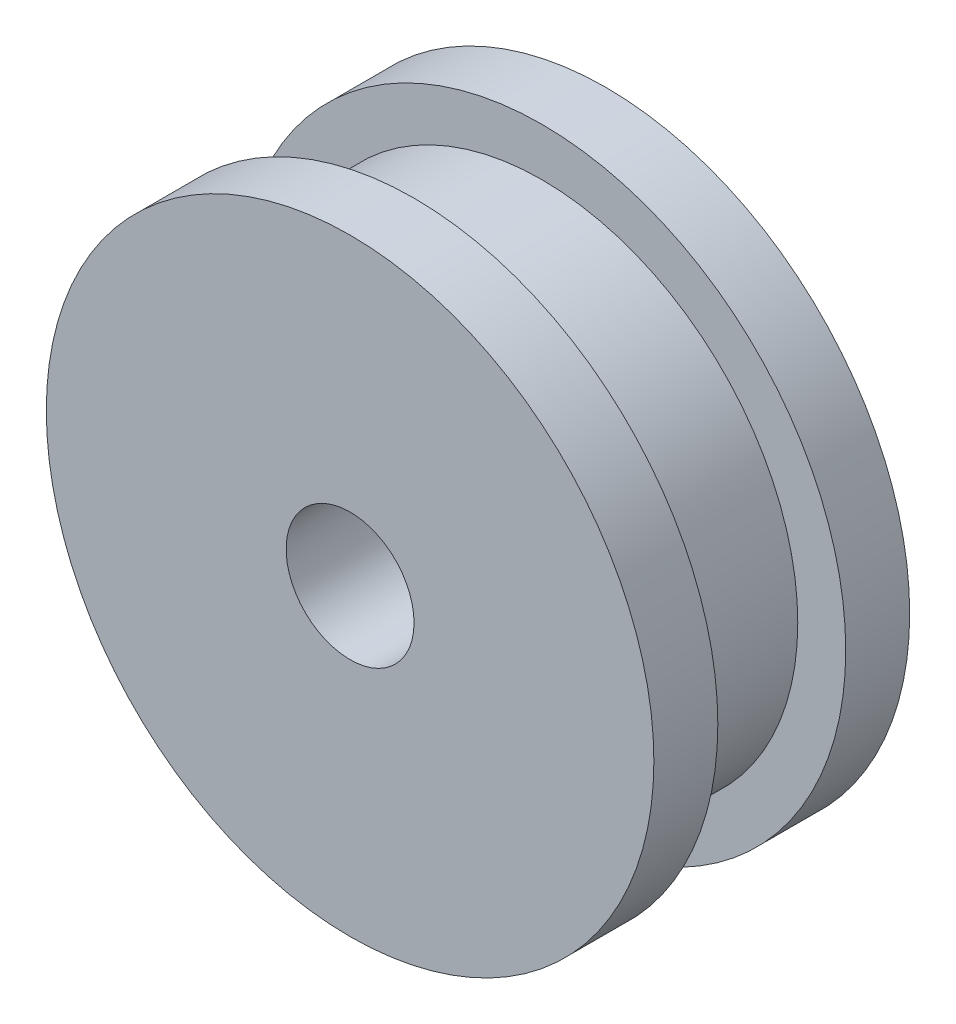
ISO-10303-21;
HEADER;
FILE_DESCRIPTION(('STEP AP214'),'2;1');
FILE_NAME('part.step','',(''),(''),'','','');
FILE_SCHEMA(('AUTOMOTIVE_DESIGN { 1 0 10303 214 1 1 1 1 }'));
ENDSEC;
DATA;
#1=APPLICATION_CONTEXT('core data for automotive mechanical design processes');
#2=APPLICATION_PROTOCOL_DEFINITION('international standard','automotive_design',2000,#1);
#3=PRODUCT_CONTEXT('',#1,'mechanical');
#4=PRODUCT('Part','Part','',(#3));
#5=PRODUCT_RELATED_PRODUCT_CATEGORY('part','',(#4));
#6=PRODUCT_DEFINITION_FORMATION('','',#4);
#7=PRODUCT_DEFINITION_CONTEXT('part definition',#1,'design');
#8=PRODUCT_DEFINITION('design','',#6,#7);
#9=PRODUCT_DEFINITION_SHAPE('','',#8);
#10=(LENGTH_UNIT() NAMED_UNIT(*) SI_UNIT(.MILLI.,.METRE.));
#11=(NAMED_UNIT(*) PLANE_ANGLE_UNIT() SI_UNIT($,.RADIAN.));
#12=(NAMED_UNIT(*) SI_UNIT($,.STERADIAN.) SOLID_ANGLE_UNIT());
#13=UNCERTAINTY_MEASURE_WITH_UNIT(LENGTH_MEASURE(1.E-05),#10,'distance_accuracy_value','');
#14=(GEOMETRIC_REPRESENTATION_CONTEXT(3) GLOBAL_UNCERTAINTY_ASSIGNED_CONTEXT((#13)) GLOBAL_UNIT_ASSIGNED_CONTEXT((#10,
#11,#12)) REPRESENTATION_CONTEXT('',''));
#15=CARTESIAN_POINT('',(0.,0.,0.));
#16=DIRECTION('',(0.,0.,1.));
#17=DIRECTION('',(1.,0.,0.));
#18=AXIS2_PLACEMENT_3D('',#15,#16,#17);
#19=CARTESIAN_POINT('',(0.,0.,1.));
#20=DIRECTION('',(0.,0.,-1.));
#21=DIRECTION('',(-1.,0.,0.));
#22=AXIS2_PLACEMENT_3D('',#19,#20,#21);
#23=CYLINDRICAL_SURFACE('',#22,4.);
#24=CARTESIAN_POINT('',(0.,0.,1.));
#25=DIRECTION('',(0.,0.,1.));
#26=DIRECTION('',(1.,0.,0.));
#27=AXIS2_PLACEMENT_3D('',#24,#25,#26);
#28=CIRCLE('',#27,4.);
#29=CARTESIAN_POINT('',(4.,0.,1.));
#30=VERTEX_POINT('',#29);
#31=EDGE_CURVE('E10',#30,#30,#28,.T.);
#32=ORIENTED_EDGE('',*,*,#31,.F.);
#33=EDGE_LOOP('',(#32));
#34=FACE_BOUND('',#33,.T.);
#35=CARTESIAN_POINT('',(0.,0.,-1.));
#36=DIRECTION('',(0.,0.,1.));
#37=DIRECTION('',(1.,0.,0.));
#38=AXIS2_PLACEMENT_3D('',#35,#36,#37);
#39=CIRCLE('',#38,4.);
#40=CARTESIAN_POINT('',(4.,0.,-1.));
#41=VERTEX_POINT('',#40);
#42=EDGE_CURVE('E48',#41,#41,#39,.T.);
#43=ORIENTED_EDGE('',*,*,#42,.T.);
#44=EDGE_LOOP('',(#43));
#45=FACE_BOUND('',#44,.T.);
#46=ADVANCED_FACE('F45',(#34,#45),#23,.T.);
#47=CARTESIAN_POINT('',(0.,0.,2.));
#48=DIRECTION('',(0.,0.,-1.));
#49=DIRECTION('',(-1.,0.,0.));
#50=AXIS2_PLACEMENT_3D('',#47,#48,#49);
#51=CYLINDRICAL_SURFACE('',#50,4.75);
#52=CARTESIAN_POINT('',(0.,0.,2.));
#53=DIRECTION('',(0.,0.,1.));
#54=DIRECTION('',(1.,0.,0.));
#55=AXIS2_PLACEMENT_3D('',#52,#53,#54);
#56=CIRCLE('',#55,4.75);
#57=CARTESIAN_POINT('',(4.75,0.,2.));
#58=VERTEX_POINT('',#57);
#59=EDGE_CURVE('E52',#58,#58,#56,.T.);
#60=ORIENTED_EDGE('',*,*,#59,.F.);
#61=EDGE_LOOP('',(#60));
#62=FACE_BOUND('',#61,.T.);
#63=CARTESIAN_POINT('',(0.,0.,1.));
#64=DIRECTION('',(0.,0.,1.));
#65=DIRECTION('',(1.,0.,0.));
#66=AXIS2_PLACEMENT_3D('',#63,#64,#65);
#67=CIRCLE('',#66,4.75);
#68=CARTESIAN_POINT('',(4.75,0.,1.));
#69=VERTEX_POINT('',#68);
#70=EDGE_CURVE('E56',#69,#69,#67,.T.);
#71=ORIENTED_EDGE('',*,*,#70,.T.);
#72=EDGE_LOOP('',(#71));
#73=FACE_BOUND('',#72,.T.);
#74=ADVANCED_FACE('F88',(#62,#73),#51,.T.);
#75=CARTESIAN_POINT('',(0.,0.,2.));
#76=DIRECTION('',(0.,0.,1.));
#77=DIRECTION('',(1.,0.,0.));
#78=AXIS2_PLACEMENT_3D('',#75,#76,#77);
#79=PLANE('',#78);
#80=CARTESIAN_POINT('',(0.,0.,2.));
#81=DIRECTION('',(0.,0.,1.));
#82=DIRECTION('',(1.,0.,0.));
#83=AXIS2_PLACEMENT_3D('',#80,#81,#82);
#84=CIRCLE('',#83,1.);
#85=CARTESIAN_POINT('',(1.,0.,2.));
#86=VERTEX_POINT('',#85);
#87=EDGE_CURVE('E68',#86,#86,#84,.T.);
#88=ORIENTED_EDGE('',*,*,#87,.F.);
#89=EDGE_LOOP('',(#88));
#90=FACE_BOUND('',#89,.T.);
#91=ORIENTED_EDGE('',*,*,#59,.T.);
#92=EDGE_LOOP('',(#91));
#93=FACE_BOUND('',#92,.T.);
#94=ADVANCED_FACE('F84',(#90,#93),#79,.T.);
#95=CARTESIAN_POINT('',(0.,0.,1.));
#96=DIRECTION('',(0.,0.,1.));
#97=DIRECTION('',(1.,0.,0.));
#98=AXIS2_PLACEMENT_3D('',#95,#96,#97);
#99=PLANE('',#98);
#100=ORIENTED_EDGE('',*,*,#31,.T.);
#101=EDGE_LOOP('',(#100));
#102=FACE_BOUND('',#101,.T.);
#103=ORIENTED_EDGE('',*,*,#70,.F.);
#104=EDGE_LOOP('',(#103));
#105=FACE_BOUND('',#104,.T.);
#106=ADVANCED_FACE('F87',(#102,#105),#99,.F.);
#107=CARTESIAN_POINT('',(0.,0.,-2.));
#108=DIRECTION('',(0.,0.,1.));
#109=DIRECTION('',(1.,0.,0.));
#110=AXIS2_PLACEMENT_3D('',#107,#108,#109);
#111=CYLINDRICAL_SURFACE('',#110,4.75);
#112=CARTESIAN_POINT('',(0.,0.,-2.));
#113=DIRECTION('',(0.,0.,1.));
#114=DIRECTION('',(1.,0.,0.));
#115=AXIS2_PLACEMENT_3D('',#112,#113,#114);
#116=CIRCLE('',#115,4.75);
#117=CARTESIAN_POINT('',(4.75,0.,-2.));
#118=VERTEX_POINT('',#117);
#119=EDGE_CURVE('E64',#118,#118,#116,.T.);
#120=ORIENTED_EDGE('',*,*,#119,.T.);
#121=EDGE_LOOP('',(#120));
#122=FACE_BOUND('',#121,.T.);
#123=CARTESIAN_POINT('',(0.,0.,-1.));
#124=DIRECTION('',(0.,0.,1.));
#125=DIRECTION('',(1.,0.,0.));
#126=AXIS2_PLACEMENT_3D('',#123,#124,#125);
#127=CIRCLE('',#126,4.75);
#128=CARTESIAN_POINT('',(4.75,0.,-1.));
#129=VERTEX_POINT('',#128);
#130=EDGE_CURVE('E61',#129,#129,#127,.T.);
#131=ORIENTED_EDGE('',*,*,#130,.F.);
#132=EDGE_LOOP('',(#131));
#133=FACE_BOUND('',#132,.T.);
#134=ADVANCED_FACE('F97',(#122,#133),#111,.T.);
#135=CARTESIAN_POINT('',(0.,0.,-2.));
#136=DIRECTION('',(0.,0.,-1.));
#137=DIRECTION('',(1.,0.,0.));
#138=AXIS2_PLACEMENT_3D('',#135,#136,#137);
#139=PLANE('',#138);
#140=CARTESIAN_POINT('',(0.,0.,-2.));
#141=DIRECTION('',(0.,0.,1.));
#142=DIRECTION('',(1.,0.,0.));
#143=AXIS2_PLACEMENT_3D('',#140,#141,#142);
#144=CIRCLE('',#143,1.);
#145=CARTESIAN_POINT('',(1.,0.,-2.));
#146=VERTEX_POINT('',#145);
#147=EDGE_CURVE('E65',#146,#146,#144,.T.);
#148=ORIENTED_EDGE('',*,*,#147,.T.);
#149=EDGE_LOOP('',(#148));
#150=FACE_BOUND('',#149,.T.);
#151=ORIENTED_EDGE('',*,*,#119,.F.);
#152=EDGE_LOOP('',(#151));
#153=FACE_BOUND('',#152,.T.);
#154=ADVANCED_FACE('F74',(#150,#153),#139,.T.);
#155=CARTESIAN_POINT('',(0.,0.,-1.));
#156=DIRECTION('',(0.,0.,-1.));
#157=DIRECTION('',(1.,0.,0.));
#158=AXIS2_PLACEMENT_3D('',#155,#156,#157);
#159=PLANE('',#158);
#160=ORIENTED_EDGE('',*,*,#42,.F.);
#161=EDGE_LOOP('',(#160));
#162=FACE_BOUND('',#161,.T.);
#163=ORIENTED_EDGE('',*,*,#130,.T.);
#164=EDGE_LOOP('',(#163));
#165=FACE_BOUND('',#164,.T.);
#166=ADVANCED_FACE('F80',(#162,#165),#159,.F.);
#167=CARTESIAN_POINT('',(0.,0.,-2.));
#168=DIRECTION('',(0.,0.,1.));
#169=DIRECTION('',(1.,0.,0.));
#170=AXIS2_PLACEMENT_3D('',#167,#168,#169);
#171=CYLINDRICAL_SURFACE('',#170,1.);
#172=ORIENTED_EDGE('',*,*,#147,.F.);
#173=EDGE_LOOP('',(#172));
#174=FACE_BOUND('',#173,.T.);
#175=ORIENTED_EDGE('',*,*,#87,.T.);
#176=EDGE_LOOP('',(#175));
#177=FACE_BOUND('',#176,.T.);
#178=ADVANCED_FACE('F77',(#174,#177),#171,.F.);
#179=CLOSED_SHELL('',(#46,#74,#94,#106,#134,#154,#166,#178));
#180=MANIFOLD_SOLID_BREP('B2',#179);
#181=ADVANCED_BREP_SHAPE_REPRESENTATION('',(#18,#180),#14);
#182=SHAPE_DEFINITION_REPRESENTATION(#9,#181);
ENDSEC;
END-ISO-10303-21;
